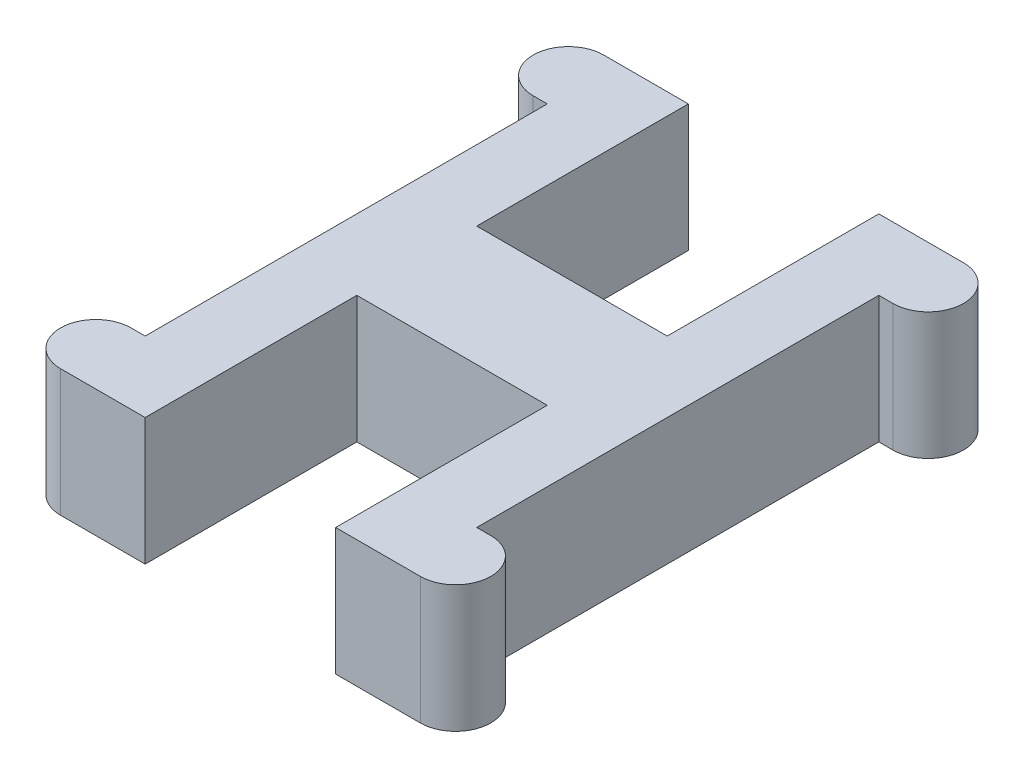
ISO-10303-21;
HEADER;
FILE_DESCRIPTION(('STEP AP214'),'2;1');
FILE_NAME('part.step','',(''),(''),'','','');
FILE_SCHEMA(('AUTOMOTIVE_DESIGN { 1 0 10303 214 1 1 1 1 }'));
ENDSEC;
DATA;
#1=APPLICATION_CONTEXT('core data for automotive mechanical design processes');
#2=APPLICATION_PROTOCOL_DEFINITION('international standard','automotive_design',2000,#1);
#3=PRODUCT_CONTEXT('',#1,'mechanical');
#4=PRODUCT('Part','Part','',(#3));
#5=PRODUCT_RELATED_PRODUCT_CATEGORY('part','',(#4));
#6=PRODUCT_DEFINITION_FORMATION('','',#4);
#7=PRODUCT_DEFINITION_CONTEXT('part definition',#1,'design');
#8=PRODUCT_DEFINITION('design','',#6,#7);
#9=PRODUCT_DEFINITION_SHAPE('','',#8);
#10=(LENGTH_UNIT() NAMED_UNIT(*) SI_UNIT(.MILLI.,.METRE.));
#11=(NAMED_UNIT(*) PLANE_ANGLE_UNIT() SI_UNIT($,.RADIAN.));
#12=(NAMED_UNIT(*) SI_UNIT($,.STERADIAN.) SOLID_ANGLE_UNIT());
#13=UNCERTAINTY_MEASURE_WITH_UNIT(LENGTH_MEASURE(1.E-05),#10,'distance_accuracy_value','');
#14=(GEOMETRIC_REPRESENTATION_CONTEXT(3) GLOBAL_UNCERTAINTY_ASSIGNED_CONTEXT((#13)) GLOBAL_UNIT_ASSIGNED_CONTEXT((#10,
#11,#12)) REPRESENTATION_CONTEXT('',''));
#15=CARTESIAN_POINT('',(0.,0.,0.));
#16=DIRECTION('',(0.,0.,1.));
#17=DIRECTION('',(1.,0.,0.));
#18=AXIS2_PLACEMENT_3D('',#15,#16,#17);
#19=CARTESIAN_POINT('',(-2.35,1.8,0.));
#20=DIRECTION('',(-1.,0.,0.));
#21=DIRECTION('',(0.,0.,1.));
#22=AXIS2_PLACEMENT_3D('',#19,#20,#21);
#23=PLANE('',#22);
#24=DIRECTION('',(0.,0.,-1.));
#25=VECTOR('',#24,1.);
#26=CARTESIAN_POINT('',(-2.35,0.,0.));
#27=LINE('',#26,#25);
#28=CARTESIAN_POINT('',(-2.35,0.,2.85));
#29=VERTEX_POINT('',#28);
#30=CARTESIAN_POINT('',(-2.35,0.,-2.85));
#31=VERTEX_POINT('',#30);
#32=EDGE_CURVE('E207',#29,#31,#27,.T.);
#33=ORIENTED_EDGE('',*,*,#32,.F.);
#34=DIRECTION('',(0.,-1.,0.));
#35=VECTOR('',#34,1.);
#36=CARTESIAN_POINT('',(-2.35,1.8,2.85));
#37=LINE('',#36,#35);
#38=CARTESIAN_POINT('',(-2.35,1.8,2.85));
#39=VERTEX_POINT('',#38);
#40=EDGE_CURVE('E11',#39,#29,#37,.T.);
#41=ORIENTED_EDGE('',*,*,#40,.F.);
#42=DIRECTION('',(0.,0.,-1.));
#43=VECTOR('',#42,1.);
#44=CARTESIAN_POINT('',(-2.35,1.8,0.));
#45=LINE('',#44,#43);
#46=CARTESIAN_POINT('',(-2.35,1.8,-2.85));
#47=VERTEX_POINT('',#46);
#48=EDGE_CURVE('E257',#39,#47,#45,.T.);
#49=ORIENTED_EDGE('',*,*,#48,.T.);
#50=DIRECTION('',(0.,-1.,0.));
#51=VECTOR('',#50,1.);
#52=CARTESIAN_POINT('',(-2.35,1.8,-2.85));
#53=LINE('',#52,#51);
#54=EDGE_CURVE('E127',#47,#31,#53,.T.);
#55=ORIENTED_EDGE('',*,*,#54,.T.);
#56=EDGE_LOOP('',(#33,#41,#49,#55));
#57=FACE_BOUND('',#56,.T.);
#58=ADVANCED_FACE('F41',(#57),#23,.T.);
#59=CARTESIAN_POINT('',(0.,1.8,2.85));
#60=DIRECTION('',(0.,0.,-1.));
#61=DIRECTION('',(-1.,0.,0.));
#62=AXIS2_PLACEMENT_3D('',#59,#60,#61);
#63=PLANE('',#62);
#64=DIRECTION('',(1.,0.,0.));
#65=VECTOR('',#64,1.);
#66=CARTESIAN_POINT('',(0.,0.,2.85));
#67=LINE('',#66,#65);
#68=CARTESIAN_POINT('',(-2.55,0.,2.85));
#69=VERTEX_POINT('',#68);
#70=EDGE_CURVE('E210',#69,#29,#67,.T.);
#71=ORIENTED_EDGE('',*,*,#70,.F.);
#72=DIRECTION('',(0.,-1.,0.));
#73=VECTOR('',#72,1.);
#74=CARTESIAN_POINT('',(-2.55,1.8,2.85));
#75=LINE('',#74,#73);
#76=CARTESIAN_POINT('',(-2.55,1.8,2.85));
#77=VERTEX_POINT('',#76);
#78=EDGE_CURVE('E49',#77,#69,#75,.T.);
#79=ORIENTED_EDGE('',*,*,#78,.F.);
#80=DIRECTION('',(1.,0.,0.));
#81=VECTOR('',#80,1.);
#82=CARTESIAN_POINT('',(0.,1.8,2.85));
#83=LINE('',#82,#81);
#84=EDGE_CURVE('E308',#77,#39,#83,.T.);
#85=ORIENTED_EDGE('',*,*,#84,.T.);
#86=ORIENTED_EDGE('',*,*,#40,.T.);
#87=EDGE_LOOP('',(#71,#79,#85,#86));
#88=FACE_BOUND('',#87,.T.);
#89=ADVANCED_FACE('F307',(#88),#63,.T.);
#90=CARTESIAN_POINT('',(-2.55,1.8,3.35));
#91=DIRECTION('',(0.,-1.,0.));
#92=DIRECTION('',(0.,0.,-1.));
#93=AXIS2_PLACEMENT_3D('',#90,#91,#92);
#94=CYLINDRICAL_SURFACE('',#93,0.5);
#95=CARTESIAN_POINT('',(-2.55,0.,3.35));
#96=DIRECTION('',(0.,1.,0.));
#97=DIRECTION('',(0.,0.,1.));
#98=AXIS2_PLACEMENT_3D('',#95,#96,#97);
#99=CIRCLE('',#98,0.5);
#100=CARTESIAN_POINT('',(-2.55,0.,3.85));
#101=VERTEX_POINT('',#100);
#102=EDGE_CURVE('E213',#69,#101,#99,.T.);
#103=ORIENTED_EDGE('',*,*,#102,.T.);
#104=DIRECTION('',(0.,-1.,0.));
#105=VECTOR('',#104,1.);
#106=CARTESIAN_POINT('',(-2.55,1.8,3.85));
#107=LINE('',#106,#105);
#108=CARTESIAN_POINT('',(-2.55,1.8,3.85));
#109=VERTEX_POINT('',#108);
#110=EDGE_CURVE('E291',#109,#101,#107,.T.);
#111=ORIENTED_EDGE('',*,*,#110,.F.);
#112=CARTESIAN_POINT('',(-2.55,1.8,3.35));
#113=DIRECTION('',(0.,1.,0.));
#114=DIRECTION('',(0.,0.,1.));
#115=AXIS2_PLACEMENT_3D('',#112,#113,#114);
#116=CIRCLE('',#115,0.5);
#117=EDGE_CURVE('E298',#77,#109,#116,.T.);
#118=ORIENTED_EDGE('',*,*,#117,.F.);
#119=ORIENTED_EDGE('',*,*,#78,.T.);
#120=EDGE_LOOP('',(#103,#111,#118,#119));
#121=FACE_BOUND('',#120,.T.);
#122=ADVANCED_FACE('F296',(#121),#94,.T.);
#123=CARTESIAN_POINT('',(0.,1.8,3.85));
#124=DIRECTION('',(0.,0.,-1.));
#125=DIRECTION('',(-1.,0.,0.));
#126=AXIS2_PLACEMENT_3D('',#123,#124,#125);
#127=PLANE('',#126);
#128=DIRECTION('',(1.,0.,0.));
#129=VECTOR('',#128,1.);
#130=CARTESIAN_POINT('',(0.,0.,3.85));
#131=LINE('',#130,#129);
#132=CARTESIAN_POINT('',(-1.35,0.,3.85));
#133=VERTEX_POINT('',#132);
#134=EDGE_CURVE('E215',#101,#133,#131,.T.);
#135=ORIENTED_EDGE('',*,*,#134,.T.);
#136=DIRECTION('',(0.,-1.,0.));
#137=VECTOR('',#136,1.);
#138=CARTESIAN_POINT('',(-1.35,1.8,3.85));
#139=LINE('',#138,#137);
#140=CARTESIAN_POINT('',(-1.35,1.8,3.85));
#141=VERTEX_POINT('',#140);
#142=EDGE_CURVE('E288',#141,#133,#139,.T.);
#143=ORIENTED_EDGE('',*,*,#142,.F.);
#144=DIRECTION('',(1.,0.,0.));
#145=VECTOR('',#144,1.);
#146=CARTESIAN_POINT('',(0.,1.8,3.85));
#147=LINE('',#146,#145);
#148=EDGE_CURVE('E316',#109,#141,#147,.T.);
#149=ORIENTED_EDGE('',*,*,#148,.F.);
#150=ORIENTED_EDGE('',*,*,#110,.T.);
#151=EDGE_LOOP('',(#135,#143,#149,#150));
#152=FACE_BOUND('',#151,.T.);
#153=ADVANCED_FACE('F402',(#152),#127,.F.);
#154=CARTESIAN_POINT('',(-1.35,1.8,0.));
#155=DIRECTION('',(-1.,0.,0.));
#156=DIRECTION('',(0.,0.,1.));
#157=AXIS2_PLACEMENT_3D('',#154,#155,#156);
#158=PLANE('',#157);
#159=DIRECTION('',(0.,0.,-1.));
#160=VECTOR('',#159,1.);
#161=CARTESIAN_POINT('',(-1.35,0.,0.));
#162=LINE('',#161,#160);
#163=CARTESIAN_POINT('',(-1.35,0.,0.849999999999999));
#164=VERTEX_POINT('',#163);
#165=EDGE_CURVE('E217',#133,#164,#162,.T.);
#166=ORIENTED_EDGE('',*,*,#165,.T.);
#167=DIRECTION('',(0.,-1.,0.));
#168=VECTOR('',#167,1.);
#169=CARTESIAN_POINT('',(-1.35,1.8,0.849999999999999));
#170=LINE('',#169,#168);
#171=CARTESIAN_POINT('',(-1.35,1.8,0.849999999999999));
#172=VERTEX_POINT('',#171);
#173=EDGE_CURVE('E286',#172,#164,#170,.T.);
#174=ORIENTED_EDGE('',*,*,#173,.F.);
#175=DIRECTION('',(0.,0.,-1.));
#176=VECTOR('',#175,1.);
#177=CARTESIAN_POINT('',(-1.35,1.8,0.));
#178=LINE('',#177,#176);
#179=EDGE_CURVE('E318',#141,#172,#178,.T.);
#180=ORIENTED_EDGE('',*,*,#179,.F.);
#181=ORIENTED_EDGE('',*,*,#142,.T.);
#182=EDGE_LOOP('',(#166,#174,#180,#181));
#183=FACE_BOUND('',#182,.T.);
#184=ADVANCED_FACE('F398',(#183),#158,.F.);
#185=CARTESIAN_POINT('',(0.,1.8,0.849999999999999));
#186=DIRECTION('',(0.,0.,1.));
#187=DIRECTION('',(1.,0.,0.));
#188=AXIS2_PLACEMENT_3D('',#185,#186,#187);
#189=PLANE('',#188);
#190=DIRECTION('',(-1.,0.,0.));
#191=VECTOR('',#190,1.);
#192=CARTESIAN_POINT('',(0.,0.,0.849999999999999));
#193=LINE('',#192,#191);
#194=CARTESIAN_POINT('',(1.35,0.,0.849999999999999));
#195=VERTEX_POINT('',#194);
#196=EDGE_CURVE('E220',#195,#164,#193,.T.);
#197=ORIENTED_EDGE('',*,*,#196,.F.);
#198=DIRECTION('',(0.,-1.,0.));
#199=VECTOR('',#198,1.);
#200=CARTESIAN_POINT('',(1.35,1.8,0.849999999999999));
#201=LINE('',#200,#199);
#202=CARTESIAN_POINT('',(1.35,1.8,0.849999999999999));
#203=VERTEX_POINT('',#202);
#204=EDGE_CURVE('E284',#203,#195,#201,.T.);
#205=ORIENTED_EDGE('',*,*,#204,.F.);
#206=DIRECTION('',(-1.,0.,0.));
#207=VECTOR('',#206,1.);
#208=CARTESIAN_POINT('',(0.,1.8,0.849999999999999));
#209=LINE('',#208,#207);
#210=EDGE_CURVE('E320',#203,#172,#209,.T.);
#211=ORIENTED_EDGE('',*,*,#210,.T.);
#212=ORIENTED_EDGE('',*,*,#173,.T.);
#213=EDGE_LOOP('',(#197,#205,#211,#212));
#214=FACE_BOUND('',#213,.T.);
#215=ADVANCED_FACE('F393',(#214),#189,.T.);
#216=CARTESIAN_POINT('',(1.35,1.8,0.));
#217=DIRECTION('',(-1.,0.,0.));
#218=DIRECTION('',(0.,0.,1.));
#219=AXIS2_PLACEMENT_3D('',#216,#217,#218);
#220=PLANE('',#219);
#221=DIRECTION('',(0.,0.,-1.));
#222=VECTOR('',#221,1.);
#223=CARTESIAN_POINT('',(1.35,0.,0.));
#224=LINE('',#223,#222);
#225=CARTESIAN_POINT('',(1.35,0.,3.85));
#226=VERTEX_POINT('',#225);
#227=EDGE_CURVE('E223',#226,#195,#224,.T.);
#228=ORIENTED_EDGE('',*,*,#227,.F.);
#229=DIRECTION('',(0.,-1.,0.));
#230=VECTOR('',#229,1.);
#231=CARTESIAN_POINT('',(1.35,1.8,3.85));
#232=LINE('',#231,#230);
#233=CARTESIAN_POINT('',(1.35,1.8,3.85));
#234=VERTEX_POINT('',#233);
#235=EDGE_CURVE('E282',#234,#226,#232,.T.);
#236=ORIENTED_EDGE('',*,*,#235,.F.);
#237=DIRECTION('',(0.,0.,-1.));
#238=VECTOR('',#237,1.);
#239=CARTESIAN_POINT('',(1.35,1.8,0.));
#240=LINE('',#239,#238);
#241=EDGE_CURVE('E323',#234,#203,#240,.T.);
#242=ORIENTED_EDGE('',*,*,#241,.T.);
#243=ORIENTED_EDGE('',*,*,#204,.T.);
#244=EDGE_LOOP('',(#228,#236,#242,#243));
#245=FACE_BOUND('',#244,.T.);
#246=ADVANCED_FACE('F390',(#245),#220,.T.);
#247=CARTESIAN_POINT('',(0.,1.8,3.85));
#248=DIRECTION('',(0.,0.,-1.));
#249=DIRECTION('',(-1.,0.,0.));
#250=AXIS2_PLACEMENT_3D('',#247,#248,#249);
#251=PLANE('',#250);
#252=DIRECTION('',(1.,0.,0.));
#253=VECTOR('',#252,1.);
#254=CARTESIAN_POINT('',(0.,0.,3.85));
#255=LINE('',#254,#253);
#256=CARTESIAN_POINT('',(2.55,0.,3.85));
#257=VERTEX_POINT('',#256);
#258=EDGE_CURVE('E226',#226,#257,#255,.T.);
#259=ORIENTED_EDGE('',*,*,#258,.T.);
#260=DIRECTION('',(0.,-1.,0.));
#261=VECTOR('',#260,1.);
#262=CARTESIAN_POINT('',(2.55,1.8,3.85));
#263=LINE('',#262,#261);
#264=CARTESIAN_POINT('',(2.55,1.8,3.85));
#265=VERTEX_POINT('',#264);
#266=EDGE_CURVE('E279',#265,#257,#263,.T.);
#267=ORIENTED_EDGE('',*,*,#266,.F.);
#268=DIRECTION('',(1.,0.,0.));
#269=VECTOR('',#268,1.);
#270=CARTESIAN_POINT('',(0.,1.8,3.85));
#271=LINE('',#270,#269);
#272=EDGE_CURVE('E326',#234,#265,#271,.T.);
#273=ORIENTED_EDGE('',*,*,#272,.F.);
#274=ORIENTED_EDGE('',*,*,#235,.T.);
#275=EDGE_LOOP('',(#259,#267,#273,#274));
#276=FACE_BOUND('',#275,.T.);
#277=ADVANCED_FACE('F387',(#276),#251,.F.);
#278=CARTESIAN_POINT('',(2.55,1.8,3.35));
#279=DIRECTION('',(0.,-1.,0.));
#280=DIRECTION('',(0.,0.,-1.));
#281=AXIS2_PLACEMENT_3D('',#278,#279,#280);
#282=CYLINDRICAL_SURFACE('',#281,0.5);
#283=CARTESIAN_POINT('',(2.55,0.,3.35));
#284=DIRECTION('',(0.,1.,0.));
#285=DIRECTION('',(0.,0.,1.));
#286=AXIS2_PLACEMENT_3D('',#283,#284,#285);
#287=CIRCLE('',#286,0.5);
#288=CARTESIAN_POINT('',(2.55,0.,2.85));
#289=VERTEX_POINT('',#288);
#290=EDGE_CURVE('E228',#257,#289,#287,.T.);
#291=ORIENTED_EDGE('',*,*,#290,.T.);
#292=DIRECTION('',(0.,-1.,0.));
#293=VECTOR('',#292,1.);
#294=CARTESIAN_POINT('',(2.55,1.8,2.85));
#295=LINE('',#294,#293);
#296=CARTESIAN_POINT('',(2.55,1.8,2.85));
#297=VERTEX_POINT('',#296);
#298=EDGE_CURVE('E277',#297,#289,#295,.T.);
#299=ORIENTED_EDGE('',*,*,#298,.F.);
#300=CARTESIAN_POINT('',(2.55,1.8,3.35));
#301=DIRECTION('',(0.,1.,0.));
#302=DIRECTION('',(0.,0.,1.));
#303=AXIS2_PLACEMENT_3D('',#300,#301,#302);
#304=CIRCLE('',#303,0.5);
#305=EDGE_CURVE('E328',#265,#297,#304,.T.);
#306=ORIENTED_EDGE('',*,*,#305,.F.);
#307=ORIENTED_EDGE('',*,*,#266,.T.);
#308=EDGE_LOOP('',(#291,#299,#306,#307));
#309=FACE_BOUND('',#308,.T.);
#310=ADVANCED_FACE('F382',(#309),#282,.T.);
#311=CARTESIAN_POINT('',(0.,1.8,2.85));
#312=DIRECTION('',(0.,0.,-1.));
#313=DIRECTION('',(-1.,0.,0.));
#314=AXIS2_PLACEMENT_3D('',#311,#312,#313);
#315=PLANE('',#314);
#316=DIRECTION('',(1.,0.,0.));
#317=VECTOR('',#316,1.);
#318=CARTESIAN_POINT('',(0.,0.,2.85));
#319=LINE('',#318,#317);
#320=CARTESIAN_POINT('',(2.35,0.,2.85));
#321=VERTEX_POINT('',#320);
#322=EDGE_CURVE('E231',#321,#289,#319,.T.);
#323=ORIENTED_EDGE('',*,*,#322,.F.);
#324=DIRECTION('',(0.,-1.,0.));
#325=VECTOR('',#324,1.);
#326=CARTESIAN_POINT('',(2.35,1.8,2.85));
#327=LINE('',#326,#325);
#328=CARTESIAN_POINT('',(2.35,1.8,2.85));
#329=VERTEX_POINT('',#328);
#330=EDGE_CURVE('E275',#329,#321,#327,.T.);
#331=ORIENTED_EDGE('',*,*,#330,.F.);
#332=DIRECTION('',(1.,0.,0.));
#333=VECTOR('',#332,1.);
#334=CARTESIAN_POINT('',(0.,1.8,2.85));
#335=LINE('',#334,#333);
#336=EDGE_CURVE('E330',#329,#297,#335,.T.);
#337=ORIENTED_EDGE('',*,*,#336,.T.);
#338=ORIENTED_EDGE('',*,*,#298,.T.);
#339=EDGE_LOOP('',(#323,#331,#337,#338));
#340=FACE_BOUND('',#339,.T.);
#341=ADVANCED_FACE('F376',(#340),#315,.T.);
#342=CARTESIAN_POINT('',(2.35,1.8,0.));
#343=DIRECTION('',(-1.,0.,0.));
#344=DIRECTION('',(0.,0.,1.));
#345=AXIS2_PLACEMENT_3D('',#342,#343,#344);
#346=PLANE('',#345);
#347=DIRECTION('',(0.,0.,-1.));
#348=VECTOR('',#347,1.);
#349=CARTESIAN_POINT('',(2.35,0.,0.));
#350=LINE('',#349,#348);
#351=CARTESIAN_POINT('',(2.35,0.,-2.85));
#352=VERTEX_POINT('',#351);
#353=EDGE_CURVE('E234',#321,#352,#350,.T.);
#354=ORIENTED_EDGE('',*,*,#353,.T.);
#355=DIRECTION('',(0.,-1.,0.));
#356=VECTOR('',#355,1.);
#357=CARTESIAN_POINT('',(2.35,1.8,-2.85));
#358=LINE('',#357,#356);
#359=CARTESIAN_POINT('',(2.35,1.8,-2.85));
#360=VERTEX_POINT('',#359);
#361=EDGE_CURVE('E272',#360,#352,#358,.T.);
#362=ORIENTED_EDGE('',*,*,#361,.F.);
#363=DIRECTION('',(0.,0.,-1.));
#364=VECTOR('',#363,1.);
#365=CARTESIAN_POINT('',(2.35,1.8,0.));
#366=LINE('',#365,#364);
#367=EDGE_CURVE('E333',#329,#360,#366,.T.);
#368=ORIENTED_EDGE('',*,*,#367,.F.);
#369=ORIENTED_EDGE('',*,*,#330,.T.);
#370=EDGE_LOOP('',(#354,#362,#368,#369));
#371=FACE_BOUND('',#370,.T.);
#372=ADVANCED_FACE('F373',(#371),#346,.F.);
#373=CARTESIAN_POINT('',(0.,1.8,-2.85));
#374=DIRECTION('',(0.,0.,-1.));
#375=DIRECTION('',(-1.,0.,0.));
#376=AXIS2_PLACEMENT_3D('',#373,#374,#375);
#377=PLANE('',#376);
#378=DIRECTION('',(1.,0.,0.));
#379=VECTOR('',#378,1.);
#380=CARTESIAN_POINT('',(0.,0.,-2.85));
#381=LINE('',#380,#379);
#382=CARTESIAN_POINT('',(2.55,0.,-2.85));
#383=VERTEX_POINT('',#382);
#384=EDGE_CURVE('E236',#352,#383,#381,.T.);
#385=ORIENTED_EDGE('',*,*,#384,.T.);
#386=DIRECTION('',(0.,-1.,0.));
#387=VECTOR('',#386,1.);
#388=CARTESIAN_POINT('',(2.55,1.8,-2.85));
#389=LINE('',#388,#387);
#390=CARTESIAN_POINT('',(2.55,1.8,-2.85));
#391=VERTEX_POINT('',#390);
#392=EDGE_CURVE('E269',#391,#383,#389,.T.);
#393=ORIENTED_EDGE('',*,*,#392,.F.);
#394=DIRECTION('',(1.,0.,0.));
#395=VECTOR('',#394,1.);
#396=CARTESIAN_POINT('',(0.,1.8,-2.85));
#397=LINE('',#396,#395);
#398=EDGE_CURVE('E335',#360,#391,#397,.T.);
#399=ORIENTED_EDGE('',*,*,#398,.F.);
#400=ORIENTED_EDGE('',*,*,#361,.T.);
#401=EDGE_LOOP('',(#385,#393,#399,#400));
#402=FACE_BOUND('',#401,.T.);
#403=ADVANCED_FACE('F368',(#402),#377,.F.);
#404=CARTESIAN_POINT('',(2.55,1.8,-3.35));
#405=DIRECTION('',(0.,-1.,0.));
#406=DIRECTION('',(0.,0.,-1.));
#407=AXIS2_PLACEMENT_3D('',#404,#405,#406);
#408=CYLINDRICAL_SURFACE('',#407,0.5);
#409=CARTESIAN_POINT('',(2.55,0.,-3.35));
#410=DIRECTION('',(0.,1.,0.));
#411=DIRECTION('',(0.,0.,1.));
#412=AXIS2_PLACEMENT_3D('',#409,#410,#411);
#413=CIRCLE('',#412,0.5);
#414=CARTESIAN_POINT('',(2.55,0.,-3.85));
#415=VERTEX_POINT('',#414);
#416=EDGE_CURVE('E238',#383,#415,#413,.T.);
#417=ORIENTED_EDGE('',*,*,#416,.T.);
#418=DIRECTION('',(0.,-1.,0.));
#419=VECTOR('',#418,1.);
#420=CARTESIAN_POINT('',(2.55,1.8,-3.85));
#421=LINE('',#420,#419);
#422=CARTESIAN_POINT('',(2.55,1.8,-3.85));
#423=VERTEX_POINT('',#422);
#424=EDGE_CURVE('E267',#423,#415,#421,.T.);
#425=ORIENTED_EDGE('',*,*,#424,.F.);
#426=CARTESIAN_POINT('',(2.55,1.8,-3.35));
#427=DIRECTION('',(0.,1.,0.));
#428=DIRECTION('',(0.,0.,1.));
#429=AXIS2_PLACEMENT_3D('',#426,#427,#428);
#430=CIRCLE('',#429,0.5);
#431=EDGE_CURVE('E337',#391,#423,#430,.T.);
#432=ORIENTED_EDGE('',*,*,#431,.F.);
#433=ORIENTED_EDGE('',*,*,#392,.T.);
#434=EDGE_LOOP('',(#417,#425,#432,#433));
#435=FACE_BOUND('',#434,.T.);
#436=ADVANCED_FACE('F362',(#435),#408,.T.);
#437=CARTESIAN_POINT('',(0.,1.8,-3.85));
#438=DIRECTION('',(0.,0.,-1.));
#439=DIRECTION('',(-1.,0.,0.));
#440=AXIS2_PLACEMENT_3D('',#437,#438,#439);
#441=PLANE('',#440);
#442=DIRECTION('',(1.,0.,0.));
#443=VECTOR('',#442,1.);
#444=CARTESIAN_POINT('',(0.,0.,-3.85));
#445=LINE('',#444,#443);
#446=CARTESIAN_POINT('',(1.35,0.,-3.85));
#447=VERTEX_POINT('',#446);
#448=EDGE_CURVE('E241',#447,#415,#445,.T.);
#449=ORIENTED_EDGE('',*,*,#448,.F.);
#450=DIRECTION('',(0.,-1.,0.));
#451=VECTOR('',#450,1.);
#452=CARTESIAN_POINT('',(1.35,1.8,-3.85));
#453=LINE('',#452,#451);
#454=CARTESIAN_POINT('',(1.35,1.8,-3.85));
#455=VERTEX_POINT('',#454);
#456=EDGE_CURVE('E265',#455,#447,#453,.T.);
#457=ORIENTED_EDGE('',*,*,#456,.F.);
#458=DIRECTION('',(1.,0.,0.));
#459=VECTOR('',#458,1.);
#460=CARTESIAN_POINT('',(0.,1.8,-3.85));
#461=LINE('',#460,#459);
#462=EDGE_CURVE('E339',#455,#423,#461,.T.);
#463=ORIENTED_EDGE('',*,*,#462,.T.);
#464=ORIENTED_EDGE('',*,*,#424,.T.);
#465=EDGE_LOOP('',(#449,#457,#463,#464));
#466=FACE_BOUND('',#465,.T.);
#467=ADVANCED_FACE('F358',(#466),#441,.T.);
#468=CARTESIAN_POINT('',(1.35,1.8,0.));
#469=DIRECTION('',(1.,0.,0.));
#470=DIRECTION('',(0.,0.,-1.));
#471=AXIS2_PLACEMENT_3D('',#468,#469,#470);
#472=PLANE('',#471);
#473=DIRECTION('',(0.,0.,1.));
#474=VECTOR('',#473,1.);
#475=CARTESIAN_POINT('',(1.35,0.,0.));
#476=LINE('',#475,#474);
#477=CARTESIAN_POINT('',(1.35,0.,-0.849999999999999));
#478=VERTEX_POINT('',#477);
#479=EDGE_CURVE('E244',#447,#478,#476,.T.);
#480=ORIENTED_EDGE('',*,*,#479,.T.);
#481=DIRECTION('',(0.,-1.,0.));
#482=VECTOR('',#481,1.);
#483=CARTESIAN_POINT('',(1.35,1.8,-0.849999999999999));
#484=LINE('',#483,#482);
#485=CARTESIAN_POINT('',(1.35,1.8,-0.849999999999999));
#486=VERTEX_POINT('',#485);
#487=EDGE_CURVE('E263',#486,#478,#484,.T.);
#488=ORIENTED_EDGE('',*,*,#487,.F.);
#489=DIRECTION('',(0.,0.,1.));
#490=VECTOR('',#489,1.);
#491=CARTESIAN_POINT('',(1.35,1.8,0.));
#492=LINE('',#491,#490);
#493=EDGE_CURVE('E342',#455,#486,#492,.T.);
#494=ORIENTED_EDGE('',*,*,#493,.F.);
#495=ORIENTED_EDGE('',*,*,#456,.T.);
#496=EDGE_LOOP('',(#480,#488,#494,#495));
#497=FACE_BOUND('',#496,.T.);
#498=ADVANCED_FACE('F504',(#497),#472,.F.);
#499=CARTESIAN_POINT('',(0.,1.8,-0.849999999999999));
#500=DIRECTION('',(0.,0.,-1.));
#501=DIRECTION('',(-1.,0.,0.));
#502=AXIS2_PLACEMENT_3D('',#499,#500,#501);
#503=PLANE('',#502);
#504=DIRECTION('',(1.,0.,0.));
#505=VECTOR('',#504,1.);
#506=CARTESIAN_POINT('',(0.,0.,-0.849999999999999));
#507=LINE('',#506,#505);
#508=CARTESIAN_POINT('',(-1.35,0.,-0.849999999999999));
#509=VERTEX_POINT('',#508);
#510=EDGE_CURVE('E247',#509,#478,#507,.T.);
#511=ORIENTED_EDGE('',*,*,#510,.F.);
#512=DIRECTION('',(0.,-1.,0.));
#513=VECTOR('',#512,1.);
#514=CARTESIAN_POINT('',(-1.35,1.8,-0.849999999999999));
#515=LINE('',#514,#513);
#516=CARTESIAN_POINT('',(-1.35,1.8,-0.849999999999999));
#517=VERTEX_POINT('',#516);
#518=EDGE_CURVE('E261',#517,#509,#515,.T.);
#519=ORIENTED_EDGE('',*,*,#518,.F.);
#520=DIRECTION('',(1.,0.,0.));
#521=VECTOR('',#520,1.);
#522=CARTESIAN_POINT('',(0.,1.8,-0.849999999999999));
#523=LINE('',#522,#521);
#524=EDGE_CURVE('E202',#517,#486,#523,.T.);
#525=ORIENTED_EDGE('',*,*,#524,.T.);
#526=ORIENTED_EDGE('',*,*,#487,.T.);
#527=EDGE_LOOP('',(#511,#519,#525,#526));
#528=FACE_BOUND('',#527,.T.);
#529=ADVANCED_FACE('F346',(#528),#503,.T.);
#530=CARTESIAN_POINT('',(-1.35,1.8,0.));
#531=DIRECTION('',(1.,0.,0.));
#532=DIRECTION('',(0.,0.,-1.));
#533=AXIS2_PLACEMENT_3D('',#530,#531,#532);
#534=PLANE('',#533);
#535=DIRECTION('',(0.,0.,1.));
#536=VECTOR('',#535,1.);
#537=CARTESIAN_POINT('',(-1.35,0.,0.));
#538=LINE('',#537,#536);
#539=CARTESIAN_POINT('',(-1.35,0.,-3.85));
#540=VERTEX_POINT('',#539);
#541=EDGE_CURVE('E250',#540,#509,#538,.T.);
#542=ORIENTED_EDGE('',*,*,#541,.F.);
#543=DIRECTION('',(0.,-1.,0.));
#544=VECTOR('',#543,1.);
#545=CARTESIAN_POINT('',(-1.35,1.8,-3.85));
#546=LINE('',#545,#544);
#547=CARTESIAN_POINT('',(-1.35,1.8,-3.85));
#548=VERTEX_POINT('',#547);
#549=EDGE_CURVE('E190',#548,#540,#546,.T.);
#550=ORIENTED_EDGE('',*,*,#549,.F.);
#551=DIRECTION('',(0.,0.,1.));
#552=VECTOR('',#551,1.);
#553=CARTESIAN_POINT('',(-1.35,1.8,0.));
#554=LINE('',#553,#552);
#555=EDGE_CURVE('E200',#548,#517,#554,.T.);
#556=ORIENTED_EDGE('',*,*,#555,.T.);
#557=ORIENTED_EDGE('',*,*,#518,.T.);
#558=EDGE_LOOP('',(#542,#550,#556,#557));
#559=FACE_BOUND('',#558,.T.);
#560=ADVANCED_FACE('F352',(#559),#534,.T.);
#561=CARTESIAN_POINT('',(0.,1.8,-3.85));
#562=DIRECTION('',(0.,0.,-1.));
#563=DIRECTION('',(-1.,0.,0.));
#564=AXIS2_PLACEMENT_3D('',#561,#562,#563);
#565=PLANE('',#564);
#566=DIRECTION('',(1.,0.,0.));
#567=VECTOR('',#566,1.);
#568=CARTESIAN_POINT('',(0.,0.,-3.85));
#569=LINE('',#568,#567);
#570=CARTESIAN_POINT('',(-2.55,0.,-3.85));
#571=VERTEX_POINT('',#570);
#572=EDGE_CURVE('E189',#571,#540,#569,.T.);
#573=ORIENTED_EDGE('',*,*,#572,.F.);
#574=DIRECTION('',(0.,-1.,0.));
#575=VECTOR('',#574,1.);
#576=CARTESIAN_POINT('',(-2.55,1.8,-3.85));
#577=LINE('',#576,#575);
#578=CARTESIAN_POINT('',(-2.55,1.8,-3.85));
#579=VERTEX_POINT('',#578);
#580=EDGE_CURVE('E183',#579,#571,#577,.T.);
#581=ORIENTED_EDGE('',*,*,#580,.F.);
#582=DIRECTION('',(1.,0.,0.));
#583=VECTOR('',#582,1.);
#584=CARTESIAN_POINT('',(0.,1.8,-3.85));
#585=LINE('',#584,#583);
#586=EDGE_CURVE('E187',#579,#548,#585,.T.);
#587=ORIENTED_EDGE('',*,*,#586,.T.);
#588=ORIENTED_EDGE('',*,*,#549,.T.);
#589=EDGE_LOOP('',(#573,#581,#587,#588));
#590=FACE_BOUND('',#589,.T.);
#591=ADVANCED_FACE('F185',(#590),#565,.T.);
#592=CARTESIAN_POINT('',(-2.55,1.8,-3.35));
#593=DIRECTION('',(0.,-1.,0.));
#594=DIRECTION('',(0.,0.,-1.));
#595=AXIS2_PLACEMENT_3D('',#592,#593,#594);
#596=CYLINDRICAL_SURFACE('',#595,0.5);
#597=CARTESIAN_POINT('',(-2.55,0.,-3.35));
#598=DIRECTION('',(0.,1.,0.));
#599=DIRECTION('',(0.,0.,1.));
#600=AXIS2_PLACEMENT_3D('',#597,#598,#599);
#601=CIRCLE('',#600,0.5);
#602=CARTESIAN_POINT('',(-2.55,0.,-2.85));
#603=VERTEX_POINT('',#602);
#604=EDGE_CURVE('E120',#571,#603,#601,.T.);
#605=ORIENTED_EDGE('',*,*,#604,.T.);
#606=DIRECTION('',(0.,-1.,0.));
#607=VECTOR('',#606,1.);
#608=CARTESIAN_POINT('',(-2.55,1.8,-2.85));
#609=LINE('',#608,#607);
#610=CARTESIAN_POINT('',(-2.55,1.8,-2.85));
#611=VERTEX_POINT('',#610);
#612=EDGE_CURVE('E191',#611,#603,#609,.T.);
#613=ORIENTED_EDGE('',*,*,#612,.F.);
#614=CARTESIAN_POINT('',(-2.55,1.8,-3.35));
#615=DIRECTION('',(0.,1.,0.));
#616=DIRECTION('',(0.,0.,1.));
#617=AXIS2_PLACEMENT_3D('',#614,#615,#616);
#618=CIRCLE('',#617,0.5);
#619=EDGE_CURVE('E193',#579,#611,#618,.T.);
#620=ORIENTED_EDGE('',*,*,#619,.F.);
#621=ORIENTED_EDGE('',*,*,#580,.T.);
#622=EDGE_LOOP('',(#605,#613,#620,#621));
#623=FACE_BOUND('',#622,.T.);
#624=ADVANCED_FACE('F194',(#623),#596,.T.);
#625=CARTESIAN_POINT('',(0.,1.8,-2.85));
#626=DIRECTION('',(0.,0.,-1.));
#627=DIRECTION('',(-1.,0.,0.));
#628=AXIS2_PLACEMENT_3D('',#625,#626,#627);
#629=PLANE('',#628);
#630=DIRECTION('',(1.,0.,0.));
#631=VECTOR('',#630,1.);
#632=CARTESIAN_POINT('',(0.,0.,-2.85));
#633=LINE('',#632,#631);
#634=EDGE_CURVE('E255',#603,#31,#633,.T.);
#635=ORIENTED_EDGE('',*,*,#634,.T.);
#636=ORIENTED_EDGE('',*,*,#54,.F.);
#637=DIRECTION('',(1.,0.,0.));
#638=VECTOR('',#637,1.);
#639=CARTESIAN_POINT('',(0.,1.8,-2.85));
#640=LINE('',#639,#638);
#641=EDGE_CURVE('E57',#611,#47,#640,.T.);
#642=ORIENTED_EDGE('',*,*,#641,.F.);
#643=ORIENTED_EDGE('',*,*,#612,.T.);
#644=EDGE_LOOP('',(#635,#636,#642,#643));
#645=FACE_BOUND('',#644,.T.);
#646=ADVANCED_FACE('F311',(#645),#629,.F.);
#647=CARTESIAN_POINT('',(0.,1.8,0.));
#648=DIRECTION('',(0.,1.,0.));
#649=DIRECTION('',(0.,0.,1.));
#650=AXIS2_PLACEMENT_3D('',#647,#648,#649);
#651=PLANE('',#650);
#652=ORIENTED_EDGE('',*,*,#48,.F.);
#653=ORIENTED_EDGE('',*,*,#84,.F.);
#654=ORIENTED_EDGE('',*,*,#117,.T.);
#655=ORIENTED_EDGE('',*,*,#148,.T.);
#656=ORIENTED_EDGE('',*,*,#179,.T.);
#657=ORIENTED_EDGE('',*,*,#210,.F.);
#658=ORIENTED_EDGE('',*,*,#241,.F.);
#659=ORIENTED_EDGE('',*,*,#272,.T.);
#660=ORIENTED_EDGE('',*,*,#305,.T.);
#661=ORIENTED_EDGE('',*,*,#336,.F.);
#662=ORIENTED_EDGE('',*,*,#367,.T.);
#663=ORIENTED_EDGE('',*,*,#398,.T.);
#664=ORIENTED_EDGE('',*,*,#431,.T.);
#665=ORIENTED_EDGE('',*,*,#462,.F.);
#666=ORIENTED_EDGE('',*,*,#493,.T.);
#667=ORIENTED_EDGE('',*,*,#524,.F.);
#668=ORIENTED_EDGE('',*,*,#555,.F.);
#669=ORIENTED_EDGE('',*,*,#586,.F.);
#670=ORIENTED_EDGE('',*,*,#619,.T.);
#671=ORIENTED_EDGE('',*,*,#641,.T.);
#672=EDGE_LOOP('',(#652,#653,#654,#655,#656,#657,#658,#659,#660,#661,#662,#663,#664,#665,#666,
#667,#668,#669,#670,#671));
#673=FACE_BOUND('',#672,.T.);
#674=ADVANCED_FACE('F197',(#673),#651,.T.);
#675=CARTESIAN_POINT('',(0.,0.,0.));
#676=DIRECTION('',(0.,1.,0.));
#677=DIRECTION('',(0.,0.,1.));
#678=AXIS2_PLACEMENT_3D('',#675,#676,#677);
#679=PLANE('',#678);
#680=ORIENTED_EDGE('',*,*,#32,.T.);
#681=ORIENTED_EDGE('',*,*,#634,.F.);
#682=ORIENTED_EDGE('',*,*,#604,.F.);
#683=ORIENTED_EDGE('',*,*,#572,.T.);
#684=ORIENTED_EDGE('',*,*,#541,.T.);
#685=ORIENTED_EDGE('',*,*,#510,.T.);
#686=ORIENTED_EDGE('',*,*,#479,.F.);
#687=ORIENTED_EDGE('',*,*,#448,.T.);
#688=ORIENTED_EDGE('',*,*,#416,.F.);
#689=ORIENTED_EDGE('',*,*,#384,.F.);
#690=ORIENTED_EDGE('',*,*,#353,.F.);
#691=ORIENTED_EDGE('',*,*,#322,.T.);
#692=ORIENTED_EDGE('',*,*,#290,.F.);
#693=ORIENTED_EDGE('',*,*,#258,.F.);
#694=ORIENTED_EDGE('',*,*,#227,.T.);
#695=ORIENTED_EDGE('',*,*,#196,.T.);
#696=ORIENTED_EDGE('',*,*,#165,.F.);
#697=ORIENTED_EDGE('',*,*,#134,.F.);
#698=ORIENTED_EDGE('',*,*,#102,.F.);
#699=ORIENTED_EDGE('',*,*,#70,.T.);
#700=EDGE_LOOP('',(#680,#681,#682,#683,#684,#685,#686,#687,#688,#689,#690,#691,#692,#693,#694,
#695,#696,#697,#698,#699));
#701=FACE_BOUND('',#700,.T.);
#702=ADVANCED_FACE('F305',(#701),#679,.F.);
#703=CLOSED_SHELL('',(#58,#89,#122,#153,#184,#215,#246,#277,#310,#341,#372,#403,#436,#467,#498,
#529,#560,#591,#624,#646,#674,#702));
#704=MANIFOLD_SOLID_BREP('B2',#703);
#705=ADVANCED_BREP_SHAPE_REPRESENTATION('',(#18,#704),#14);
#706=SHAPE_DEFINITION_REPRESENTATION(#9,#705);
ENDSEC;
END-ISO-10303-21;
